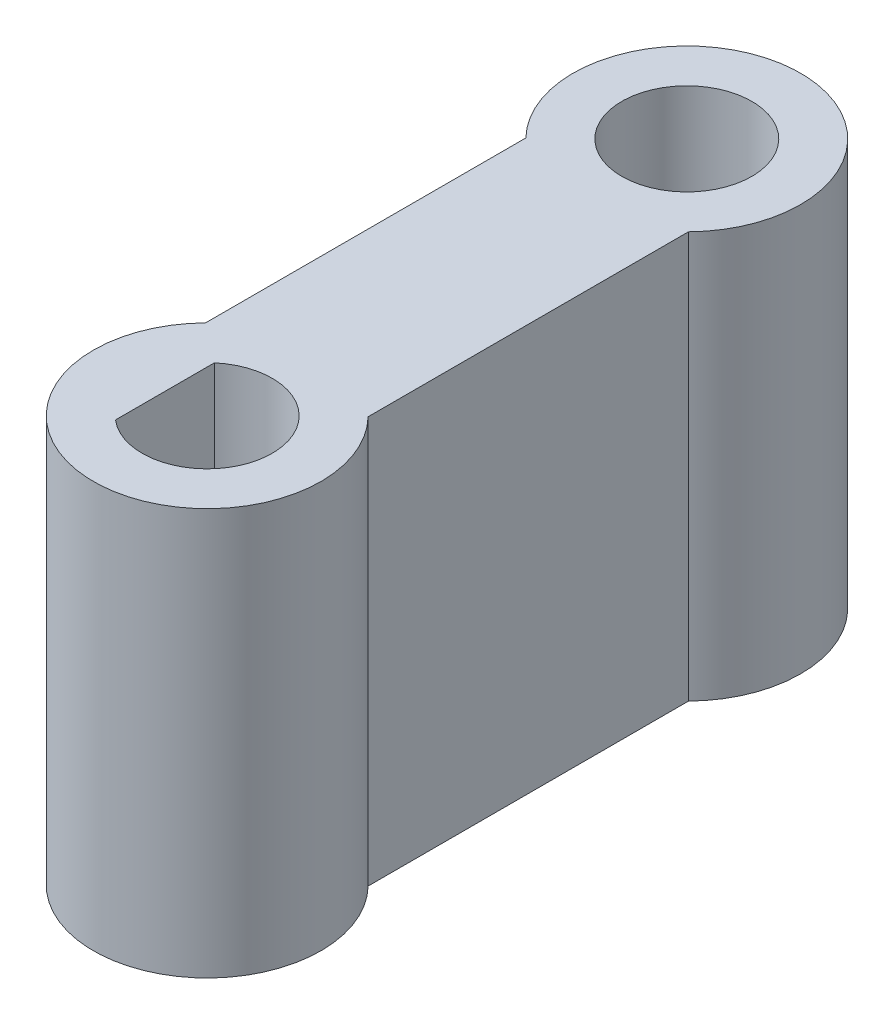
ISO-10303-21;
HEADER;
FILE_DESCRIPTION(('STEP AP214'),'2;1');
FILE_NAME('part.step','',(''),(''),'','','');
FILE_SCHEMA(('AUTOMOTIVE_DESIGN { 1 0 10303 214 1 1 1 1 }'));
ENDSEC;
DATA;
#1=APPLICATION_CONTEXT('core data for automotive mechanical design processes');
#2=APPLICATION_PROTOCOL_DEFINITION('international standard','automotive_design',2000,#1);
#3=PRODUCT_CONTEXT('',#1,'mechanical');
#4=PRODUCT('Part','Part','',(#3));
#5=PRODUCT_RELATED_PRODUCT_CATEGORY('part','',(#4));
#6=PRODUCT_DEFINITION_FORMATION('','',#4);
#7=PRODUCT_DEFINITION_CONTEXT('part definition',#1,'design');
#8=PRODUCT_DEFINITION('design','',#6,#7);
#9=PRODUCT_DEFINITION_SHAPE('','',#8);
#10=(LENGTH_UNIT() NAMED_UNIT(*) SI_UNIT(.MILLI.,.METRE.));
#11=(NAMED_UNIT(*) PLANE_ANGLE_UNIT() SI_UNIT($,.RADIAN.));
#12=(NAMED_UNIT(*) SI_UNIT($,.STERADIAN.) SOLID_ANGLE_UNIT());
#13=UNCERTAINTY_MEASURE_WITH_UNIT(LENGTH_MEASURE(1.E-05),#10,'distance_accuracy_value','');
#14=(GEOMETRIC_REPRESENTATION_CONTEXT(3) GLOBAL_UNCERTAINTY_ASSIGNED_CONTEXT((#13)) GLOBAL_UNIT_ASSIGNED_CONTEXT((#10,
#11,#12)) REPRESENTATION_CONTEXT('',''));
#15=CARTESIAN_POINT('',(0.,0.,0.));
#16=DIRECTION('',(0.,0.,1.));
#17=DIRECTION('',(1.,0.,0.));
#18=AXIS2_PLACEMENT_3D('',#15,#16,#17);
#19=CARTESIAN_POINT('',(0.,25.,0.));
#20=DIRECTION('',(0.,1.,0.));
#21=DIRECTION('',(0.,0.,1.));
#22=AXIS2_PLACEMENT_3D('',#19,#20,#21);
#23=PLANE('',#22);
#24=DIRECTION('',(0.,0.,-1.));
#25=VECTOR('',#24,1.);
#26=CARTESIAN_POINT('',(5.,25.,0.));
#27=LINE('',#26,#25);
#28=CARTESIAN_POINT('',(5.,25.,-4.89897948556636));
#29=VERTEX_POINT('',#28);
#30=CARTESIAN_POINT('',(5.,25.,-24.6010205144336));
#31=VERTEX_POINT('',#30);
#32=EDGE_CURVE('E116',#29,#31,#27,.T.);
#33=ORIENTED_EDGE('',*,*,#32,.T.);
#34=CARTESIAN_POINT('',(0.,25.,-29.5));
#35=DIRECTION('',(0.,1.,0.));
#36=DIRECTION('',(0.,0.,1.));
#37=AXIS2_PLACEMENT_3D('',#34,#35,#36);
#38=CIRCLE('',#37,7.);
#39=CARTESIAN_POINT('',(-5.,25.,-24.6010205144336));
#40=VERTEX_POINT('',#39);
#41=EDGE_CURVE('E131',#31,#40,#38,.T.);
#42=ORIENTED_EDGE('',*,*,#41,.T.);
#43=DIRECTION('',(0.,0.,1.));
#44=VECTOR('',#43,1.);
#45=CARTESIAN_POINT('',(-5.,25.,0.));
#46=LINE('',#45,#44);
#47=CARTESIAN_POINT('',(-5.,25.,-4.89897948556636));
#48=VERTEX_POINT('',#47);
#49=EDGE_CURVE('E113',#40,#48,#46,.T.);
#50=ORIENTED_EDGE('',*,*,#49,.T.);
#51=CARTESIAN_POINT('',(0.,25.,0.));
#52=DIRECTION('',(0.,1.,0.));
#53=DIRECTION('',(0.,0.,1.));
#54=AXIS2_PLACEMENT_3D('',#51,#52,#53);
#55=CIRCLE('',#54,7.);
#56=EDGE_CURVE('E123',#48,#29,#55,.T.);
#57=ORIENTED_EDGE('',*,*,#56,.T.);
#58=EDGE_LOOP('',(#33,#42,#50,#57));
#59=FACE_BOUND('',#58,.T.);
#60=CARTESIAN_POINT('',(0.,25.,0.));
#61=DIRECTION('',(0.,1.,0.));
#62=DIRECTION('',(0.,0.,1.));
#63=AXIS2_PLACEMENT_3D('',#60,#61,#62);
#64=CIRCLE('',#63,4.);
#65=CARTESIAN_POINT('',(-2.6,25.,3.03973683071413));
#66=VERTEX_POINT('',#65);
#67=CARTESIAN_POINT('',(-2.6,25.,-3.03973683071413));
#68=VERTEX_POINT('',#67);
#69=EDGE_CURVE('E99',#66,#68,#64,.T.);
#70=ORIENTED_EDGE('',*,*,#69,.F.);
#71=DIRECTION('',(0.,0.,-1.));
#72=VECTOR('',#71,1.);
#73=CARTESIAN_POINT('',(-2.6,25.,-3.03973683071413));
#74=LINE('',#73,#72);
#75=EDGE_CURVE('E89',#66,#68,#74,.T.);
#76=ORIENTED_EDGE('',*,*,#75,.T.);
#77=EDGE_LOOP('',(#70,#76));
#78=FACE_BOUND('',#77,.T.);
#79=CARTESIAN_POINT('',(0.,25.,-29.5));
#80=DIRECTION('',(0.,1.,0.));
#81=DIRECTION('',(0.,0.,1.));
#82=AXIS2_PLACEMENT_3D('',#79,#80,#81);
#83=CIRCLE('',#82,4.);
#84=CARTESIAN_POINT('',(0.,25.,-25.5));
#85=VERTEX_POINT('',#84);
#86=EDGE_CURVE('E105',#85,#85,#83,.T.);
#87=ORIENTED_EDGE('',*,*,#86,.F.);
#88=EDGE_LOOP('',(#87));
#89=FACE_BOUND('',#88,.T.);
#90=ADVANCED_FACE('F36',(#59,#78,#89),#23,.T.);
#91=CARTESIAN_POINT('',(0.,0.,0.));
#92=DIRECTION('',(0.,1.,0.));
#93=DIRECTION('',(0.,0.,1.));
#94=AXIS2_PLACEMENT_3D('',#91,#92,#93);
#95=PLANE('',#94);
#96=DIRECTION('',(0.,0.,1.));
#97=VECTOR('',#96,1.);
#98=CARTESIAN_POINT('',(-5.,0.,0.));
#99=LINE('',#98,#97);
#100=CARTESIAN_POINT('',(-5.,0.,-24.6010205144336));
#101=VERTEX_POINT('',#100);
#102=CARTESIAN_POINT('',(-5.,0.,-4.89897948556636));
#103=VERTEX_POINT('',#102);
#104=EDGE_CURVE('E114',#101,#103,#99,.T.);
#105=ORIENTED_EDGE('',*,*,#104,.F.);
#106=CARTESIAN_POINT('',(0.,0.,-29.5));
#107=DIRECTION('',(0.,1.,0.));
#108=DIRECTION('',(0.,0.,1.));
#109=AXIS2_PLACEMENT_3D('',#106,#107,#108);
#110=CIRCLE('',#109,7.);
#111=CARTESIAN_POINT('',(5.,0.,-24.6010205144336));
#112=VERTEX_POINT('',#111);
#113=EDGE_CURVE('E130',#101,#112,#110,.F.);
#114=ORIENTED_EDGE('',*,*,#113,.T.);
#115=DIRECTION('',(0.,0.,-1.));
#116=VECTOR('',#115,1.);
#117=CARTESIAN_POINT('',(5.,0.,0.));
#118=LINE('',#117,#116);
#119=CARTESIAN_POINT('',(5.,0.,-4.89897948556636));
#120=VERTEX_POINT('',#119);
#121=EDGE_CURVE('E61',#120,#112,#118,.T.);
#122=ORIENTED_EDGE('',*,*,#121,.F.);
#123=CARTESIAN_POINT('',(0.,0.,0.));
#124=DIRECTION('',(0.,1.,0.));
#125=DIRECTION('',(0.,0.,1.));
#126=AXIS2_PLACEMENT_3D('',#123,#124,#125);
#127=CIRCLE('',#126,7.);
#128=EDGE_CURVE('E122',#120,#103,#127,.F.);
#129=ORIENTED_EDGE('',*,*,#128,.T.);
#130=EDGE_LOOP('',(#105,#114,#122,#129));
#131=FACE_BOUND('',#130,.T.);
#132=CARTESIAN_POINT('',(0.,0.,0.));
#133=DIRECTION('',(0.,1.,0.));
#134=DIRECTION('',(0.,0.,1.));
#135=AXIS2_PLACEMENT_3D('',#132,#133,#134);
#136=CIRCLE('',#135,4.);
#137=CARTESIAN_POINT('',(-2.6,0.,3.03973683071413));
#138=VERTEX_POINT('',#137);
#139=CARTESIAN_POINT('',(-2.6,0.,-3.03973683071413));
#140=VERTEX_POINT('',#139);
#141=EDGE_CURVE('E40',#138,#140,#136,.T.);
#142=ORIENTED_EDGE('',*,*,#141,.T.);
#143=DIRECTION('',(0.,0.,1.));
#144=VECTOR('',#143,1.);
#145=CARTESIAN_POINT('',(-2.6,0.,-3.03973683071413));
#146=LINE('',#145,#144);
#147=EDGE_CURVE('E134',#140,#138,#146,.T.);
#148=ORIENTED_EDGE('',*,*,#147,.T.);
#149=EDGE_LOOP('',(#142,#148));
#150=FACE_BOUND('',#149,.T.);
#151=CARTESIAN_POINT('',(0.,0.,-29.5));
#152=DIRECTION('',(0.,1.,0.));
#153=DIRECTION('',(0.,0.,1.));
#154=AXIS2_PLACEMENT_3D('',#151,#152,#153);
#155=CIRCLE('',#154,4.);
#156=CARTESIAN_POINT('',(0.,0.,-25.5));
#157=VERTEX_POINT('',#156);
#158=EDGE_CURVE('E103',#157,#157,#155,.T.);
#159=ORIENTED_EDGE('',*,*,#158,.T.);
#160=EDGE_LOOP('',(#159));
#161=FACE_BOUND('',#160,.T.);
#162=ADVANCED_FACE('F139',(#131,#150,#161),#95,.F.);
#163=CARTESIAN_POINT('',(5.,25.,0.));
#164=DIRECTION('',(-1.,0.,0.));
#165=DIRECTION('',(0.,0.,1.));
#166=AXIS2_PLACEMENT_3D('',#163,#164,#165);
#167=PLANE('',#166);
#168=ORIENTED_EDGE('',*,*,#121,.T.);
#169=DIRECTION('',(0.,1.,0.));
#170=VECTOR('',#169,1.);
#171=CARTESIAN_POINT('',(5.,-19.7989898732233,-24.6010205144336));
#172=LINE('',#171,#170);
#173=EDGE_CURVE('E126',#112,#31,#172,.T.);
#174=ORIENTED_EDGE('',*,*,#173,.T.);
#175=ORIENTED_EDGE('',*,*,#32,.F.);
#176=DIRECTION('',(0.,1.,0.));
#177=VECTOR('',#176,1.);
#178=CARTESIAN_POINT('',(5.,-19.7989898732233,-4.89897948556636));
#179=LINE('',#178,#177);
#180=EDGE_CURVE('E107',#29,#120,#179,.F.);
#181=ORIENTED_EDGE('',*,*,#180,.T.);
#182=EDGE_LOOP('',(#168,#174,#175,#181));
#183=FACE_BOUND('',#182,.T.);
#184=ADVANCED_FACE('F142',(#183),#167,.F.);
#185=CARTESIAN_POINT('',(-5.,25.,0.));
#186=DIRECTION('',(1.,0.,0.));
#187=DIRECTION('',(0.,0.,-1.));
#188=AXIS2_PLACEMENT_3D('',#185,#186,#187);
#189=PLANE('',#188);
#190=ORIENTED_EDGE('',*,*,#49,.F.);
#191=DIRECTION('',(0.,1.,0.));
#192=VECTOR('',#191,1.);
#193=CARTESIAN_POINT('',(-5.,-19.7989898732233,-24.6010205144336));
#194=LINE('',#193,#192);
#195=EDGE_CURVE('E12',#40,#101,#194,.F.);
#196=ORIENTED_EDGE('',*,*,#195,.T.);
#197=ORIENTED_EDGE('',*,*,#104,.T.);
#198=DIRECTION('',(0.,1.,0.));
#199=VECTOR('',#198,1.);
#200=CARTESIAN_POINT('',(-5.,-19.7989898732233,-4.89897948556636));
#201=LINE('',#200,#199);
#202=EDGE_CURVE('E45',#103,#48,#201,.T.);
#203=ORIENTED_EDGE('',*,*,#202,.T.);
#204=EDGE_LOOP('',(#190,#196,#197,#203));
#205=FACE_BOUND('',#204,.T.);
#206=ADVANCED_FACE('F149',(#205),#189,.F.);
#207=CARTESIAN_POINT('',(0.,25.,-29.5));
#208=DIRECTION('',(0.,-1.,0.));
#209=DIRECTION('',(0.,0.,-1.));
#210=AXIS2_PLACEMENT_3D('',#207,#208,#209);
#211=CYLINDRICAL_SURFACE('',#210,4.);
#212=ORIENTED_EDGE('',*,*,#86,.T.);
#213=EDGE_LOOP('',(#212));
#214=FACE_BOUND('',#213,.T.);
#215=ORIENTED_EDGE('',*,*,#158,.F.);
#216=EDGE_LOOP('',(#215));
#217=FACE_BOUND('',#216,.T.);
#218=ADVANCED_FACE('F147',(#214,#217),#211,.F.);
#219=CARTESIAN_POINT('',(0.,25.,0.));
#220=DIRECTION('',(0.,-1.,0.));
#221=DIRECTION('',(0.,0.,-1.));
#222=AXIS2_PLACEMENT_3D('',#219,#220,#221);
#223=CYLINDRICAL_SURFACE('',#222,4.);
#224=DIRECTION('',(0.,1.,0.));
#225=VECTOR('',#224,1.);
#226=CARTESIAN_POINT('',(-2.6,-6.23858958419289,3.03973683071413));
#227=LINE('',#226,#225);
#228=EDGE_CURVE('E53',#138,#66,#227,.T.);
#229=ORIENTED_EDGE('',*,*,#228,.T.);
#230=ORIENTED_EDGE('',*,*,#69,.T.);
#231=DIRECTION('',(0.,1.,0.));
#232=VECTOR('',#231,1.);
#233=CARTESIAN_POINT('',(-2.6,-6.23858958419289,-3.03973683071413));
#234=LINE('',#233,#232);
#235=EDGE_CURVE('E92',#140,#68,#234,.T.);
#236=ORIENTED_EDGE('',*,*,#235,.F.);
#237=ORIENTED_EDGE('',*,*,#141,.F.);
#238=EDGE_LOOP('',(#229,#230,#236,#237));
#239=FACE_BOUND('',#238,.T.);
#240=ADVANCED_FACE('F38',(#239),#223,.F.);
#241=CARTESIAN_POINT('',(0.,-19.7989898732233,0.));
#242=DIRECTION('',(0.,1.,0.));
#243=DIRECTION('',(0.,0.,1.));
#244=AXIS2_PLACEMENT_3D('',#241,#242,#243);
#245=CYLINDRICAL_SURFACE('',#244,7.);
#246=ORIENTED_EDGE('',*,*,#180,.F.);
#247=ORIENTED_EDGE('',*,*,#56,.F.);
#248=ORIENTED_EDGE('',*,*,#202,.F.);
#249=ORIENTED_EDGE('',*,*,#128,.F.);
#250=EDGE_LOOP('',(#246,#247,#248,#249));
#251=FACE_BOUND('',#250,.T.);
#252=ADVANCED_FACE('F155',(#251),#245,.T.);
#253=CARTESIAN_POINT('',(0.,-19.7989898732233,-29.5));
#254=DIRECTION('',(0.,1.,0.));
#255=DIRECTION('',(0.,0.,1.));
#256=AXIS2_PLACEMENT_3D('',#253,#254,#255);
#257=CYLINDRICAL_SURFACE('',#256,7.);
#258=ORIENTED_EDGE('',*,*,#173,.F.);
#259=ORIENTED_EDGE('',*,*,#113,.F.);
#260=ORIENTED_EDGE('',*,*,#195,.F.);
#261=ORIENTED_EDGE('',*,*,#41,.F.);
#262=EDGE_LOOP('',(#258,#259,#260,#261));
#263=FACE_BOUND('',#262,.T.);
#264=ADVANCED_FACE('F185',(#263),#257,.T.);
#265=CARTESIAN_POINT('',(-2.6,-6.23858958419289,-3.03973683071413));
#266=DIRECTION('',(1.,0.,0.));
#267=DIRECTION('',(0.,0.,-1.));
#268=AXIS2_PLACEMENT_3D('',#265,#266,#267);
#269=PLANE('',#268);
#270=ORIENTED_EDGE('',*,*,#147,.F.);
#271=ORIENTED_EDGE('',*,*,#235,.T.);
#272=ORIENTED_EDGE('',*,*,#75,.F.);
#273=ORIENTED_EDGE('',*,*,#228,.F.);
#274=EDGE_LOOP('',(#270,#271,#272,#273));
#275=FACE_BOUND('',#274,.T.);
#276=ADVANCED_FACE('F90',(#275),#269,.T.);
#277=CLOSED_SHELL('',(#90,#162,#184,#206,#218,#240,#252,#264,#276));
#278=MANIFOLD_SOLID_BREP('B2',#277);
#279=ADVANCED_BREP_SHAPE_REPRESENTATION('',(#18,#278),#14);
#280=SHAPE_DEFINITION_REPRESENTATION(#9,#279);
ENDSEC;
END-ISO-10303-21;
